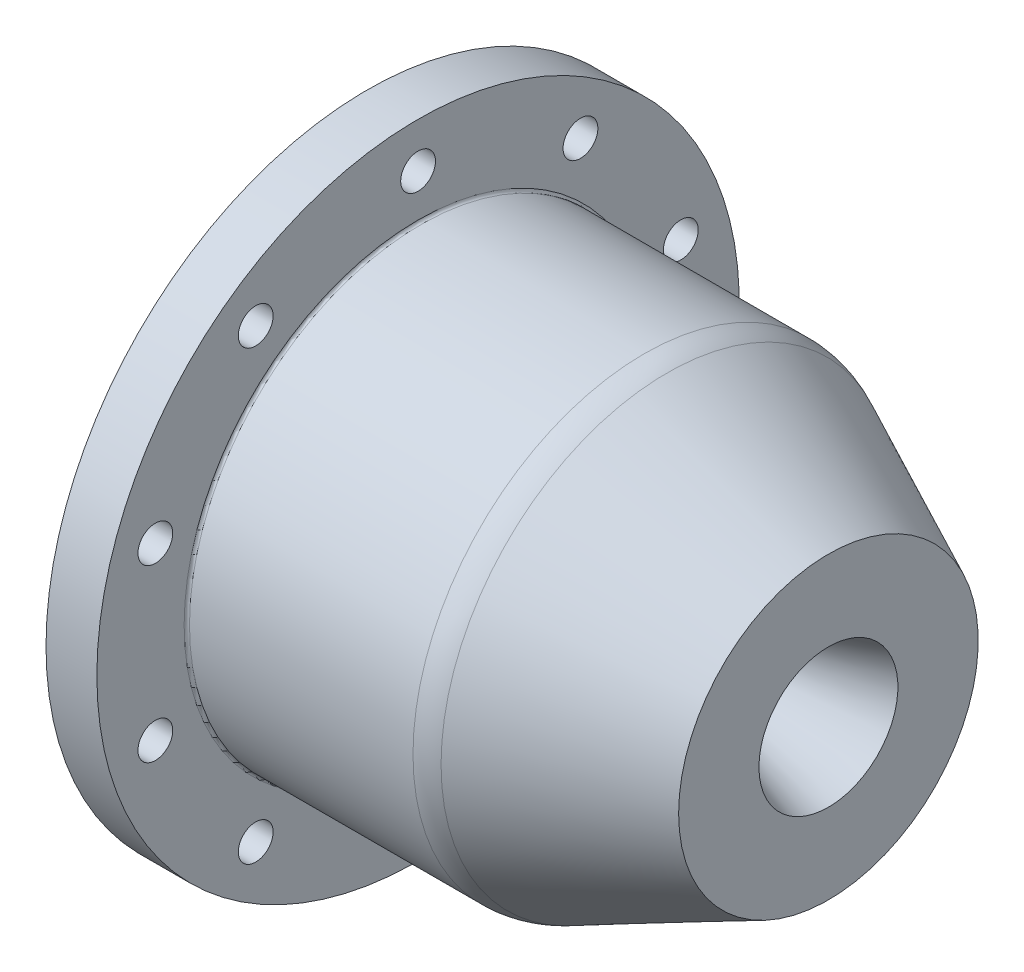
ISO-10303-21;
HEADER;
FILE_DESCRIPTION(('STEP AP214'),'2;1');
FILE_NAME('part.step','',(''),(''),'','','');
FILE_SCHEMA(('AUTOMOTIVE_DESIGN { 1 0 10303 214 1 1 1 1 }'));
ENDSEC;
DATA;
#1=APPLICATION_CONTEXT('core data for automotive mechanical design processes');
#2=APPLICATION_PROTOCOL_DEFINITION('international standard','automotive_design',2000,#1);
#3=PRODUCT_CONTEXT('',#1,'mechanical');
#4=PRODUCT('Part','Part','',(#3));
#5=PRODUCT_RELATED_PRODUCT_CATEGORY('part','',(#4));
#6=PRODUCT_DEFINITION_FORMATION('','',#4);
#7=PRODUCT_DEFINITION_CONTEXT('part definition',#1,'design');
#8=PRODUCT_DEFINITION('design','',#6,#7);
#9=PRODUCT_DEFINITION_SHAPE('','',#8);
#10=(LENGTH_UNIT() NAMED_UNIT(*) SI_UNIT(.MILLI.,.METRE.));
#11=(NAMED_UNIT(*) PLANE_ANGLE_UNIT() SI_UNIT($,.RADIAN.));
#12=(NAMED_UNIT(*) SI_UNIT($,.STERADIAN.) SOLID_ANGLE_UNIT());
#13=UNCERTAINTY_MEASURE_WITH_UNIT(LENGTH_MEASURE(1.E-05),#10,'distance_accuracy_value','');
#14=(GEOMETRIC_REPRESENTATION_CONTEXT(3) GLOBAL_UNCERTAINTY_ASSIGNED_CONTEXT((#13)) GLOBAL_UNIT_ASSIGNED_CONTEXT((#10,
#11,#12)) REPRESENTATION_CONTEXT('',''));
#15=CARTESIAN_POINT('',(0.,0.,0.));
#16=DIRECTION('',(0.,0.,1.));
#17=DIRECTION('',(1.,0.,0.));
#18=AXIS2_PLACEMENT_3D('',#15,#16,#17);
#19=CARTESIAN_POINT('',(21.0328892930556,0.,0.));
#20=DIRECTION('',(-1.,0.,0.));
#21=DIRECTION('',(0.,0.,1.));
#22=AXIS2_PLACEMENT_3D('',#19,#20,#21);
#23=TOROIDAL_SURFACE('',#22,15.834,9.);
#24=CARTESIAN_POINT('',(20.8212475059553,0.,0.));
#25=DIRECTION('',(1.,0.,0.));
#26=DIRECTION('',(0.,0.,-1.));
#27=AXIS2_PLACEMENT_3D('',#24,#25,#26);
#28=CIRCLE('',#27,6.83648880223242);
#29=CARTESIAN_POINT('',(20.8212475059553,0.,-6.83648880223242));
#30=VERTEX_POINT('',#29);
#31=EDGE_CURVE('E10',#30,#30,#28,.T.);
#32=ORIENTED_EDGE('',*,*,#31,.T.);
#33=EDGE_LOOP('',(#32));
#34=FACE_BOUND('',#33,.T.);
#35=CARTESIAN_POINT('',(13.2386606589956,0.,0.));
#36=DIRECTION('',(-1.,0.,0.));
#37=DIRECTION('',(0.,0.,1.));
#38=AXIS2_PLACEMENT_3D('',#35,#36,#37);
#39=CIRCLE('',#38,11.3340000000001);
#40=CARTESIAN_POINT('',(13.2386606589956,0.,11.3340000000001));
#41=VERTEX_POINT('',#40);
#42=EDGE_CURVE('E60',#41,#41,#39,.T.);
#43=ORIENTED_EDGE('',*,*,#42,.T.);
#44=EDGE_LOOP('',(#43));
#45=FACE_BOUND('',#44,.T.);
#46=ADVANCED_FACE('F34',(#34,#45),#23,.T.);
#47=CARTESIAN_POINT('',(7.79422863405996,0.,0.));
#48=DIRECTION('',(-1.,0.,0.));
#49=DIRECTION('',(0.,0.,1.));
#50=AXIS2_PLACEMENT_3D('',#47,#48,#49);
#51=CONICAL_SURFACE('',#50,20.5,1.03481414053965);
#52=ORIENTED_EDGE('',*,*,#42,.F.);
#53=EDGE_LOOP('',(#52));
#54=FACE_BOUND('',#53,.T.);
#55=CARTESIAN_POINT('',(7.79422863405996,0.,0.));
#56=DIRECTION('',(-1.,0.,0.));
#57=DIRECTION('',(0.,0.,1.));
#58=AXIS2_PLACEMENT_3D('',#55,#56,#57);
#59=CIRCLE('',#58,20.5);
#60=CARTESIAN_POINT('',(7.79422863405996,0.,20.5));
#61=VERTEX_POINT('',#60);
#62=EDGE_CURVE('E192',#61,#61,#59,.T.);
#63=ORIENTED_EDGE('',*,*,#62,.T.);
#64=EDGE_LOOP('',(#63));
#65=FACE_BOUND('',#64,.T.);
#66=ADVANCED_FACE('F103',(#54,#65),#51,.F.);
#67=CARTESIAN_POINT('',(0.,0.,0.));
#68=DIRECTION('',(-1.,0.,0.));
#69=DIRECTION('',(0.,0.,1.));
#70=AXIS2_PLACEMENT_3D('',#67,#68,#69);
#71=TOROIDAL_SURFACE('',#70,16.,9.);
#72=ORIENTED_EDGE('',*,*,#62,.F.);
#73=EDGE_LOOP('',(#72));
#74=FACE_BOUND('',#73,.T.);
#75=CARTESIAN_POINT('',(0.,0.,0.));
#76=DIRECTION('',(-1.,0.,0.));
#77=DIRECTION('',(0.,0.,1.));
#78=AXIS2_PLACEMENT_3D('',#75,#76,#77);
#79=CIRCLE('',#78,25.);
#80=CARTESIAN_POINT('',(0.,0.,25.));
#81=VERTEX_POINT('',#80);
#82=EDGE_CURVE('E189',#81,#81,#79,.T.);
#83=ORIENTED_EDGE('',*,*,#82,.T.);
#84=EDGE_LOOP('',(#83));
#85=FACE_BOUND('',#84,.T.);
#86=ADVANCED_FACE('F98',(#74,#85),#71,.F.);
#87=CARTESIAN_POINT('',(0.,0.,0.));
#88=DIRECTION('',(-1.,0.,0.));
#89=DIRECTION('',(0.,0.,1.));
#90=AXIS2_PLACEMENT_3D('',#87,#88,#89);
#91=CYLINDRICAL_SURFACE('',#90,25.);
#92=CARTESIAN_POINT('',(-23.35,13.2002627420486,-21.2309458936921));
#93=CARTESIAN_POINT('',(-23.45096609887,13.2002668339951,-21.2309439894007));
#94=CARTESIAN_POINT('',(-23.5520020704715,13.2075228830239,-21.2264372550872));
#95=CARTESIAN_POINT('',(-23.7512817731319,13.236333392609,-21.2084830976877));
#96=CARTESIAN_POINT('',(-23.8495221545168,13.2579043102433,-21.1950253840746));
#97=CARTESIAN_POINT('',(-24.0402953888173,13.3146305509543,-21.1594359046409));
#98=CARTESIAN_POINT('',(-24.1328313165295,13.3497784802236,-21.1373088598956));
#99=CARTESIAN_POINT('',(-24.3096103880352,13.4325120193215,-21.0848288832891));
#100=CARTESIAN_POINT('',(-24.3938553719108,13.4800948607522,-21.0544777823031));
#101=CARTESIAN_POINT('',(-24.5518487534148,13.5862794905071,-20.9861142621549));
#102=CARTESIAN_POINT('',(-24.625578790283,13.6449001484151,-20.9480887151034));
#103=CARTESIAN_POINT('',(-24.7602919172194,13.7712719697343,-20.8652286179706));
#104=CARTESIAN_POINT('',(-24.8212744651085,13.8390235213013,-20.820393778415));
#105=CARTESIAN_POINT('',(-24.9288202956351,13.9816466927085,-20.7248864448262));
#106=CARTESIAN_POINT('',(-24.9753680433373,14.0565258709516,-20.6742077414298));
#107=CARTESIAN_POINT('',(-25.052623547112,14.2110712615298,-20.5682819064808));
#108=CARTESIAN_POINT('',(-25.0833315179634,14.2907374089398,-20.5130348368847));
#109=CARTESIAN_POINT('',(-25.127983893808,14.4523423260966,-20.3994982965364));
#110=CARTESIAN_POINT('',(-25.1419575336896,14.5342768758962,-20.3412143177605));
#111=CARTESIAN_POINT('',(-25.1528349098418,14.6981683896604,-20.223106751331));
#112=CARTESIAN_POINT('',(-25.1497388911712,14.7801253532862,-20.1632831857927));
#113=CARTESIAN_POINT('',(-25.1265888584794,14.941587081606,-20.04392773414));
#114=CARTESIAN_POINT('',(-25.1065662867466,15.0210961098915,-19.9843955129195));
#115=CARTESIAN_POINT('',(-25.0501803496229,15.1756392371574,-19.8672942176502));
#116=CARTESIAN_POINT('',(-25.013816862575,15.2506733028173,-19.8097251582205));
#117=CARTESIAN_POINT('',(-24.9257459518355,15.3943378820168,-19.6982903513733));
#118=CARTESIAN_POINT('',(-24.8740243495265,15.4629624009649,-19.6444280829141));
#119=CARTESIAN_POINT('',(-24.7567156981266,15.591959081515,-19.5422003982673));
#120=CARTESIAN_POINT('',(-24.6911284402851,15.6523311188512,-19.4938350648542));
#121=CARTESIAN_POINT('',(-24.547772834418,15.7634319793512,-19.4041061279502));
#122=CARTESIAN_POINT('',(-24.4699771828953,15.8141386093502,-19.3627586617665));
#123=CARTESIAN_POINT('',(-24.3045085651699,15.9044836075416,-19.2886191231456));
#124=CARTESIAN_POINT('',(-24.2168355934982,15.9441219696056,-19.2558270554454));
#125=CARTESIAN_POINT('',(-24.0340828376075,16.0113645967966,-19.1999511619579));
#126=CARTESIAN_POINT('',(-23.9390024457073,16.0389678733755,-19.1768681336654));
#127=CARTESIAN_POINT('',(-23.7441423286693,16.0814637549854,-19.141246016476));
#128=CARTESIAN_POINT('',(-23.6443626770666,16.096356558843,-19.1287067626456));
#129=CARTESIAN_POINT('',(-23.4431760891635,16.1130517178512,-19.1146458421487));
#130=CARTESIAN_POINT('',(-23.3417733063581,16.1148833693601,-19.1130995182013));
#131=CARTESIAN_POINT('',(-23.1400082754598,16.1054895089573,-19.1210157664433));
#132=CARTESIAN_POINT('',(-23.0396460201576,16.0942640875744,-19.1304782623052));
#133=CARTESIAN_POINT('',(-22.8429196554795,16.0590465908007,-19.1600507551013));
#134=CARTESIAN_POINT('',(-22.7465514002561,16.0350681302239,-19.1801493970479));
#135=CARTESIAN_POINT('',(-22.5604204162005,15.974931827432,-19.2302645908768));
#136=CARTESIAN_POINT('',(-22.4706577667955,15.9387738387967,-19.2602812619919));
#137=CARTESIAN_POINT('',(-22.3001108588495,15.8550799501168,-19.3292362423628));
#138=CARTESIAN_POINT('',(-22.2193428420894,15.8075239411827,-19.3681903141253));
#139=CARTESIAN_POINT('',(-22.0692417467413,15.7022355499202,-19.4536470563593));
#140=CARTESIAN_POINT('',(-21.9999088156748,15.6445030363269,-19.5001498241993));
#141=CARTESIAN_POINT('',(-21.8745164122266,15.5201892714763,-19.5992357635154));
#142=CARTESIAN_POINT('',(-21.8184816978422,15.4535918701055,-19.6518300092136));
#143=CARTESIAN_POINT('',(-21.7214459516053,15.313344919332,-19.7613099392652));
#144=CARTESIAN_POINT('',(-21.6804448025965,15.2396954248918,-19.8181955901717));
#145=CARTESIAN_POINT('',(-21.6146828969911,15.0873709851147,-19.9344023499135));
#146=CARTESIAN_POINT('',(-21.5899066228709,15.0087009207479,-19.9937210738675));
#147=CARTESIAN_POINT('',(-21.5572470193628,14.8484242426891,-20.1130374211222));
#148=CARTESIAN_POINT('',(-21.5493634592616,14.7668176691182,-20.1730350351397));
#149=CARTESIAN_POINT('',(-21.5507154760921,14.6031540599151,-20.2918233074417));
#150=CARTESIAN_POINT('',(-21.5599123771475,14.5210984604309,-20.3506163884752));
#151=CARTESIAN_POINT('',(-21.5950838629638,14.3587172800508,-20.4655108505987));
#152=CARTESIAN_POINT('',(-21.6210584747545,14.2783917019424,-20.5216122273519));
#153=CARTESIAN_POINT('',(-21.6890388219524,14.1218373525927,-20.6296573721336));
#154=CARTESIAN_POINT('',(-21.7310441521619,14.0456084778574,-20.6816012452084));
#155=CARTESIAN_POINT('',(-21.8298887137846,13.8995320189649,-20.7800572191796));
#156=CARTESIAN_POINT('',(-21.8867276239761,13.8296842966678,-20.826569437667));
#157=CARTESIAN_POINT('',(-22.0137702813953,13.6983570422706,-20.9131830786092));
#158=CARTESIAN_POINT('',(-22.0840023700603,13.636895738623,-20.9532705684567));
#159=CARTESIAN_POINT('',(-22.2357922873625,13.5244205253195,-21.0260445619438));
#160=CARTESIAN_POINT('',(-22.3173528709844,13.4734091644834,-21.0587292601916));
#161=CARTESIAN_POINT('',(-22.4896048112851,13.3834063608373,-21.1160435296399));
#162=CARTESIAN_POINT('',(-22.5803097088112,13.344433101311,-21.140660918735));
#163=CARTESIAN_POINT('',(-22.7681128052767,13.2799097879075,-21.1812526222374));
#164=CARTESIAN_POINT('',(-22.8652034255637,13.2543441340559,-21.197236981969));
#165=CARTESIAN_POINT('',(-23.0273994398461,13.224057887595,-21.2161371156145));
#166=CARTESIAN_POINT('',(-23.0914585093618,13.2151478027276,-21.2216850982529));
#167=CARTESIAN_POINT('',(-23.2203354460411,13.2032489215665,-21.2290900952888));
#168=CARTESIAN_POINT('',(-23.2851533117532,13.200260113947,-21.2309471167462));
#169=CARTESIAN_POINT('',(-23.35,13.2002627420486,-21.2309458936921));
#170=B_SPLINE_CURVE_WITH_KNOTS('',3,(#92,#93,#94,#95,#96,#97,#98,#99,#100,#101,#102,#103,#104,
#105,#106,#107,#108,#109,#110,#111,#112,#113,#114,#115,#116,#117,#118,#119,#120,#121,#122,#123,
#124,#125,#126,#127,#128,#129,#130,#131,#132,#133,#134,#135,#136,#137,#138,#139,#140,#141,#142,
#143,#144,#145,#146,#147,#148,#149,#150,#151,#152,#153,#154,#155,#156,#157,#158,#159,#160,#161,
#162,#163,#164,#165,#166,#167,#168,#169),.UNSPECIFIED.,.T.,.F.,(4,2,2,2,2,2,2,2,2,2,2,2,2,2,2,2,
2,2,2,2,2,2,2,2,2,2,2,2,2,2,2,2,2,2,2,2,2,2,4),(0.,0.302661550799539,0.605671660418703,
0.908516988048946,1.21129495025204,1.5145953017647,1.81790855069315,2.12154710574395,
2.42518154350829,2.72828475424094,3.03138361351642,3.33392067891971,3.63645999672876,
3.93927949194872,4.24210354651225,4.54561476671345,4.84912615496436,5.15266246859357,
5.45619403399503,5.75904455882426,6.06189298391082,6.36441874294395,6.66694813901892,
6.97001525133769,7.27308627315242,7.57671718802164,7.88034573664839,8.18368346817249,
8.48701705681466,8.78966463403932,9.09231269884603,9.39495311432607,9.69758697665981,
10.0008684981884,10.3042239045252,10.6080353066616,10.9114924304522,11.1058808141678,
11.3002688260711),.UNSPECIFIED.);
#171=CARTESIAN_POINT('',(-23.35,13.2002627420486,-21.2309458936921));
#172=VERTEX_POINT('',#171);
#173=EDGE_CURVE('E68',#172,#172,#170,.T.);
#174=ORIENTED_EDGE('',*,*,#173,.T.);
#175=EDGE_LOOP('',(#174));
#176=FACE_BOUND('',#175,.T.);
#177=ORIENTED_EDGE('',*,*,#82,.F.);
#178=EDGE_LOOP('',(#177));
#179=FACE_BOUND('',#178,.T.);
#180=CARTESIAN_POINT('',(-46.7,0.,0.));
#181=DIRECTION('',(-1.,0.,0.));
#182=DIRECTION('',(0.,0.,1.));
#183=AXIS2_PLACEMENT_3D('',#180,#181,#182);
#184=CIRCLE('',#183,25.);
#185=CARTESIAN_POINT('',(-46.7,0.,25.));
#186=VERTEX_POINT('',#185);
#187=EDGE_CURVE('E186',#186,#186,#184,.T.);
#188=ORIENTED_EDGE('',*,*,#187,.T.);
#189=EDGE_LOOP('',(#188));
#190=FACE_BOUND('',#189,.T.);
#191=ADVANCED_FACE('F92',(#176,#179,#190),#91,.F.);
#192=CARTESIAN_POINT('',(-46.7,31.,0.));
#193=DIRECTION('',(1.,0.,0.));
#194=DIRECTION('',(0.,0.,-1.));
#195=AXIS2_PLACEMENT_3D('',#192,#193,#194);
#196=PLANE('',#195);
#197=ORIENTED_EDGE('',*,*,#187,.F.);
#198=EDGE_LOOP('',(#197));
#199=FACE_BOUND('',#198,.T.);
#200=CARTESIAN_POINT('',(-46.7,0.,0.));
#201=DIRECTION('',(-1.,0.,0.));
#202=DIRECTION('',(0.,0.,1.));
#203=AXIS2_PLACEMENT_3D('',#200,#201,#202);
#204=CIRCLE('',#203,31.);
#205=CARTESIAN_POINT('',(-46.7,0.,31.));
#206=VERTEX_POINT('',#205);
#207=EDGE_CURVE('E183',#206,#206,#204,.T.);
#208=ORIENTED_EDGE('',*,*,#207,.T.);
#209=EDGE_LOOP('',(#208));
#210=FACE_BOUND('',#209,.T.);
#211=ADVANCED_FACE('F97',(#199,#210),#196,.F.);
#212=CARTESIAN_POINT('',(0.,0.,0.));
#213=DIRECTION('',(-1.,0.,0.));
#214=DIRECTION('',(0.,0.,1.));
#215=AXIS2_PLACEMENT_3D('',#212,#213,#214);
#216=CYLINDRICAL_SURFACE('',#215,31.);
#217=ORIENTED_EDGE('',*,*,#207,.F.);
#218=EDGE_LOOP('',(#217));
#219=FACE_BOUND('',#218,.T.);
#220=CARTESIAN_POINT('',(-46.2,0.,0.));
#221=DIRECTION('',(-1.,0.,0.));
#222=DIRECTION('',(0.,0.,1.));
#223=AXIS2_PLACEMENT_3D('',#220,#221,#222);
#224=CIRCLE('',#223,31.);
#225=CARTESIAN_POINT('',(-46.2,0.,31.));
#226=VERTEX_POINT('',#225);
#227=EDGE_CURVE('E174',#226,#226,#224,.T.);
#228=ORIENTED_EDGE('',*,*,#227,.T.);
#229=EDGE_LOOP('',(#228));
#230=FACE_BOUND('',#229,.T.);
#231=ADVANCED_FACE('F275',(#219,#230),#216,.T.);
#232=CARTESIAN_POINT('',(-46.2,60.,0.));
#233=DIRECTION('',(1.,0.,0.));
#234=DIRECTION('',(0.,0.,-1.));
#235=AXIS2_PLACEMENT_3D('',#232,#233,#234);
#236=PLANE('',#235);
#237=CARTESIAN_POINT('',(-46.2,41.7452769097422,-30.3297190182905));
#238=DIRECTION('',(-1.,0.,0.));
#239=DIRECTION('',(0.,0.,1.));
#240=AXIS2_PLACEMENT_3D('',#237,#238,#239);
#241=CIRCLE('',#240,3.25000000000354);
#242=CARTESIAN_POINT('',(-46.2,41.7452769097422,-27.079719018287));
#243=VERTEX_POINT('',#242);
#244=EDGE_CURVE('E90',#243,#243,#241,.T.);
#245=ORIENTED_EDGE('',*,*,#244,.F.);
#246=EDGE_LOOP('',(#245));
#247=FACE_BOUND('',#246,.T.);
#248=CARTESIAN_POINT('',(-46.2,15.945276909739,-49.0745162408245));
#249=DIRECTION('',(-1.,0.,0.));
#250=DIRECTION('',(0.,0.,1.));
#251=AXIS2_PLACEMENT_3D('',#248,#249,#250);
#252=CIRCLE('',#251,3.25000000000819);
#253=CARTESIAN_POINT('',(-46.2,15.945276909739,-45.8245162408163));
#254=VERTEX_POINT('',#253);
#255=EDGE_CURVE('E212',#254,#254,#252,.T.);
#256=ORIENTED_EDGE('',*,*,#255,.F.);
#257=EDGE_LOOP('',(#256));
#258=FACE_BOUND('',#257,.T.);
#259=CARTESIAN_POINT('',(-46.2,-15.9452769097556,-49.0745162408191));
#260=DIRECTION('',(-1.,0.,0.));
#261=DIRECTION('',(0.,0.,1.));
#262=AXIS2_PLACEMENT_3D('',#259,#260,#261);
#263=CIRCLE('',#262,3.25000000000664);
#264=CARTESIAN_POINT('',(-46.2,-15.9452769097556,-45.8245162408125));
#265=VERTEX_POINT('',#264);
#266=EDGE_CURVE('E211',#265,#265,#263,.T.);
#267=ORIENTED_EDGE('',*,*,#266,.F.);
#268=EDGE_LOOP('',(#267));
#269=FACE_BOUND('',#268,.T.);
#270=CARTESIAN_POINT('',(-46.2,-41.7452769097524,-30.3297190182765));
#271=DIRECTION('',(-1.,0.,0.));
#272=DIRECTION('',(0.,0.,1.));
#273=AXIS2_PLACEMENT_3D('',#270,#271,#272);
#274=CIRCLE('',#273,3.25000000000382);
#275=CARTESIAN_POINT('',(-46.2,-41.7452769097524,-27.0797190182726));
#276=VERTEX_POINT('',#275);
#277=EDGE_CURVE('E210',#276,#276,#274,.T.);
#278=ORIENTED_EDGE('',*,*,#277,.F.);
#279=EDGE_LOOP('',(#278));
#280=FACE_BOUND('',#279,.T.);
#281=CARTESIAN_POINT('',(-46.2,-51.6,1.68198657821432E-11));
#282=DIRECTION('',(-1.,0.,0.));
#283=DIRECTION('',(0.,0.,1.));
#284=AXIS2_PLACEMENT_3D('',#281,#282,#283);
#285=CIRCLE('',#284,3.25000000000069);
#286=CARTESIAN_POINT('',(-46.2,-51.6,3.25000000001751));
#287=VERTEX_POINT('',#286);
#288=EDGE_CURVE('E208',#287,#287,#285,.T.);
#289=ORIENTED_EDGE('',*,*,#288,.F.);
#290=EDGE_LOOP('',(#289));
#291=FACE_BOUND('',#290,.T.);
#292=CARTESIAN_POINT('',(-46.2,-41.7452769097422,30.3297190183068));
#293=DIRECTION('',(-1.,0.,0.));
#294=DIRECTION('',(0.,0.,1.));
#295=AXIS2_PLACEMENT_3D('',#292,#293,#294);
#296=CIRCLE('',#295,3.24999999999777);
#297=CARTESIAN_POINT('',(-46.2,-41.7452769097422,33.5797190183045));
#298=VERTEX_POINT('',#297);
#299=EDGE_CURVE('E206',#298,#298,#296,.T.);
#300=ORIENTED_EDGE('',*,*,#299,.F.);
#301=EDGE_LOOP('',(#300));
#302=FACE_BOUND('',#301,.T.);
#303=CARTESIAN_POINT('',(-46.2,-15.945276909739,49.0745162408407));
#304=DIRECTION('',(-1.,0.,0.));
#305=DIRECTION('',(0.,0.,1.));
#306=AXIS2_PLACEMENT_3D('',#303,#304,#305);
#307=CIRCLE('',#306,3.24999999999712);
#308=CARTESIAN_POINT('',(-46.2,-15.945276909739,52.3245162408379));
#309=VERTEX_POINT('',#308);
#310=EDGE_CURVE('E204',#309,#309,#307,.T.);
#311=ORIENTED_EDGE('',*,*,#310,.F.);
#312=EDGE_LOOP('',(#311));
#313=FACE_BOUND('',#312,.T.);
#314=CARTESIAN_POINT('',(-46.2,15.9452769097556,49.0745162408354));
#315=DIRECTION('',(-1.,0.,0.));
#316=DIRECTION('',(0.,0.,1.));
#317=AXIS2_PLACEMENT_3D('',#314,#315,#316);
#318=CIRCLE('',#317,3.24999999999816);
#319=CARTESIAN_POINT('',(-46.2,15.9452769097556,52.3245162408335));
#320=VERTEX_POINT('',#319);
#321=EDGE_CURVE('E202',#320,#320,#318,.T.);
#322=ORIENTED_EDGE('',*,*,#321,.F.);
#323=EDGE_LOOP('',(#322));
#324=FACE_BOUND('',#323,.T.);
#325=CARTESIAN_POINT('',(-46.2,41.7452769097516,30.3297190182928));
#326=DIRECTION('',(-1.,0.,0.));
#327=DIRECTION('',(0.,0.,1.));
#328=AXIS2_PLACEMENT_3D('',#325,#326,#327);
#329=CIRCLE('',#328,3.25000000000001);
#330=CARTESIAN_POINT('',(-46.2,41.7452769097516,33.5797190182928));
#331=VERTEX_POINT('',#330);
#332=EDGE_CURVE('E200',#331,#331,#329,.T.);
#333=ORIENTED_EDGE('',*,*,#332,.F.);
#334=EDGE_LOOP('',(#333));
#335=FACE_BOUND('',#334,.T.);
#336=CARTESIAN_POINT('',(-46.2,51.6,-5.82898316369605E-13));
#337=DIRECTION('',(-1.,0.,0.));
#338=DIRECTION('',(0.,0.,1.));
#339=AXIS2_PLACEMENT_3D('',#336,#337,#338);
#340=CIRCLE('',#339,3.25);
#341=CARTESIAN_POINT('',(-46.2,51.6,3.24999999999942));
#342=VERTEX_POINT('',#341);
#343=EDGE_CURVE('E198',#342,#342,#340,.T.);
#344=ORIENTED_EDGE('',*,*,#343,.F.);
#345=EDGE_LOOP('',(#344));
#346=FACE_BOUND('',#345,.T.);
#347=ORIENTED_EDGE('',*,*,#227,.F.);
#348=EDGE_LOOP('',(#347));
#349=FACE_BOUND('',#348,.T.);
#350=CARTESIAN_POINT('',(-46.2,0.,0.));
#351=DIRECTION('',(-1.,0.,0.));
#352=DIRECTION('',(0.,0.,1.));
#353=AXIS2_PLACEMENT_3D('',#350,#351,#352);
#354=CIRCLE('',#353,60.);
#355=CARTESIAN_POINT('',(-46.2,0.,60.));
#356=VERTEX_POINT('',#355);
#357=EDGE_CURVE('E170',#356,#356,#354,.T.);
#358=ORIENTED_EDGE('',*,*,#357,.T.);
#359=EDGE_LOOP('',(#358));
#360=FACE_BOUND('',#359,.T.);
#361=ADVANCED_FACE('F280',(#247,#258,#269,#280,#291,#302,#313,#324,#335,#346,#349,#360),#236,.F.);
#362=CARTESIAN_POINT('',(0.,0.,0.));
#363=DIRECTION('',(-1.,0.,0.));
#364=DIRECTION('',(0.,0.,1.));
#365=AXIS2_PLACEMENT_3D('',#362,#363,#364);
#366=CYLINDRICAL_SURFACE('',#365,60.);
#367=ORIENTED_EDGE('',*,*,#357,.F.);
#368=EDGE_LOOP('',(#367));
#369=FACE_BOUND('',#368,.T.);
#370=CARTESIAN_POINT('',(-36.7,0.,0.));
#371=DIRECTION('',(-1.,0.,0.));
#372=DIRECTION('',(0.,0.,1.));
#373=AXIS2_PLACEMENT_3D('',#370,#371,#372);
#374=CIRCLE('',#373,60.);
#375=CARTESIAN_POINT('',(-36.7,0.,60.));
#376=VERTEX_POINT('',#375);
#377=EDGE_CURVE('E168',#376,#376,#374,.T.);
#378=ORIENTED_EDGE('',*,*,#377,.T.);
#379=EDGE_LOOP('',(#378));
#380=FACE_BOUND('',#379,.T.);
#381=ADVANCED_FACE('F126',(#369,#380),#366,.T.);
#382=CARTESIAN_POINT('',(-36.7,60.,0.));
#383=DIRECTION('',(-1.,0.,0.));
#384=DIRECTION('',(0.,0.,1.));
#385=AXIS2_PLACEMENT_3D('',#382,#383,#384);
#386=PLANE('',#385);
#387=CARTESIAN_POINT('',(-36.7,0.,0.));
#388=DIRECTION('',(-1.,0.,0.));
#389=DIRECTION('',(0.,0.,1.));
#390=AXIS2_PLACEMENT_3D('',#387,#388,#389);
#391=CIRCLE('',#390,43.7);
#392=CARTESIAN_POINT('',(-36.7,0.,43.7));
#393=VERTEX_POINT('',#392);
#394=EDGE_CURVE('E49',#393,#393,#391,.T.);
#395=ORIENTED_EDGE('',*,*,#394,.T.);
#396=EDGE_LOOP('',(#395));
#397=FACE_BOUND('',#396,.T.);
#398=CARTESIAN_POINT('',(-36.7,41.7452769097422,-30.3297190182905));
#399=DIRECTION('',(-1.,0.,0.));
#400=DIRECTION('',(0.,0.,1.));
#401=AXIS2_PLACEMENT_3D('',#398,#399,#400);
#402=CIRCLE('',#401,3.25000000000354);
#403=CARTESIAN_POINT('',(-36.7,41.7452769097422,-27.079719018287));
#404=VERTEX_POINT('',#403);
#405=EDGE_CURVE('E69',#404,#404,#402,.T.);
#406=ORIENTED_EDGE('',*,*,#405,.T.);
#407=EDGE_LOOP('',(#406));
#408=FACE_BOUND('',#407,.T.);
#409=CARTESIAN_POINT('',(-36.7,15.945276909739,-49.0745162408245));
#410=DIRECTION('',(-1.,0.,0.));
#411=DIRECTION('',(0.,0.,1.));
#412=AXIS2_PLACEMENT_3D('',#409,#410,#411);
#413=CIRCLE('',#412,3.25000000000819);
#414=CARTESIAN_POINT('',(-36.7,15.945276909739,-45.8245162408163));
#415=VERTEX_POINT('',#414);
#416=EDGE_CURVE('E133',#415,#415,#413,.T.);
#417=ORIENTED_EDGE('',*,*,#416,.T.);
#418=EDGE_LOOP('',(#417));
#419=FACE_BOUND('',#418,.T.);
#420=CARTESIAN_POINT('',(-36.7,-15.9452769097556,-49.0745162408191));
#421=DIRECTION('',(-1.,0.,0.));
#422=DIRECTION('',(0.,0.,1.));
#423=AXIS2_PLACEMENT_3D('',#420,#421,#422);
#424=CIRCLE('',#423,3.25000000000664);
#425=CARTESIAN_POINT('',(-36.7,-15.9452769097556,-45.8245162408125));
#426=VERTEX_POINT('',#425);
#427=EDGE_CURVE('E137',#426,#426,#424,.T.);
#428=ORIENTED_EDGE('',*,*,#427,.T.);
#429=EDGE_LOOP('',(#428));
#430=FACE_BOUND('',#429,.T.);
#431=CARTESIAN_POINT('',(-36.7,-41.7452769097524,-30.3297190182765));
#432=DIRECTION('',(-1.,0.,0.));
#433=DIRECTION('',(0.,0.,1.));
#434=AXIS2_PLACEMENT_3D('',#431,#432,#433);
#435=CIRCLE('',#434,3.25000000000382);
#436=CARTESIAN_POINT('',(-36.7,-41.7452769097524,-27.0797190182726));
#437=VERTEX_POINT('',#436);
#438=EDGE_CURVE('E141',#437,#437,#435,.T.);
#439=ORIENTED_EDGE('',*,*,#438,.T.);
#440=EDGE_LOOP('',(#439));
#441=FACE_BOUND('',#440,.T.);
#442=CARTESIAN_POINT('',(-36.7,-51.6,1.68198657821432E-11));
#443=DIRECTION('',(-1.,0.,0.));
#444=DIRECTION('',(0.,0.,1.));
#445=AXIS2_PLACEMENT_3D('',#442,#443,#444);
#446=CIRCLE('',#445,3.25000000000069);
#447=CARTESIAN_POINT('',(-36.7,-51.6,3.25000000001751));
#448=VERTEX_POINT('',#447);
#449=EDGE_CURVE('E145',#448,#448,#446,.T.);
#450=ORIENTED_EDGE('',*,*,#449,.T.);
#451=EDGE_LOOP('',(#450));
#452=FACE_BOUND('',#451,.T.);
#453=CARTESIAN_POINT('',(-36.7,-41.7452769097422,30.3297190183068));
#454=DIRECTION('',(-1.,0.,0.));
#455=DIRECTION('',(0.,0.,1.));
#456=AXIS2_PLACEMENT_3D('',#453,#454,#455);
#457=CIRCLE('',#456,3.24999999999777);
#458=CARTESIAN_POINT('',(-36.7,-41.7452769097422,33.5797190183045));
#459=VERTEX_POINT('',#458);
#460=EDGE_CURVE('E149',#459,#459,#457,.T.);
#461=ORIENTED_EDGE('',*,*,#460,.T.);
#462=EDGE_LOOP('',(#461));
#463=FACE_BOUND('',#462,.T.);
#464=CARTESIAN_POINT('',(-36.7,-15.945276909739,49.0745162408407));
#465=DIRECTION('',(-1.,0.,0.));
#466=DIRECTION('',(0.,0.,1.));
#467=AXIS2_PLACEMENT_3D('',#464,#465,#466);
#468=CIRCLE('',#467,3.24999999999712);
#469=CARTESIAN_POINT('',(-36.7,-15.945276909739,52.3245162408379));
#470=VERTEX_POINT('',#469);
#471=EDGE_CURVE('E153',#470,#470,#468,.T.);
#472=ORIENTED_EDGE('',*,*,#471,.T.);
#473=EDGE_LOOP('',(#472));
#474=FACE_BOUND('',#473,.T.);
#475=CARTESIAN_POINT('',(-36.7,15.9452769097556,49.0745162408354));
#476=DIRECTION('',(-1.,0.,0.));
#477=DIRECTION('',(0.,0.,1.));
#478=AXIS2_PLACEMENT_3D('',#475,#476,#477);
#479=CIRCLE('',#478,3.24999999999816);
#480=CARTESIAN_POINT('',(-36.7,15.9452769097556,52.3245162408335));
#481=VERTEX_POINT('',#480);
#482=EDGE_CURVE('E157',#481,#481,#479,.T.);
#483=ORIENTED_EDGE('',*,*,#482,.T.);
#484=EDGE_LOOP('',(#483));
#485=FACE_BOUND('',#484,.T.);
#486=CARTESIAN_POINT('',(-36.7,41.7452769097516,30.3297190182928));
#487=DIRECTION('',(-1.,0.,0.));
#488=DIRECTION('',(0.,0.,1.));
#489=AXIS2_PLACEMENT_3D('',#486,#487,#488);
#490=CIRCLE('',#489,3.25000000000001);
#491=CARTESIAN_POINT('',(-36.7,41.7452769097516,33.5797190182928));
#492=VERTEX_POINT('',#491);
#493=EDGE_CURVE('E161',#492,#492,#490,.T.);
#494=ORIENTED_EDGE('',*,*,#493,.T.);
#495=EDGE_LOOP('',(#494));
#496=FACE_BOUND('',#495,.T.);
#497=CARTESIAN_POINT('',(-36.7,51.6,-5.82898316369605E-13));
#498=DIRECTION('',(-1.,0.,0.));
#499=DIRECTION('',(0.,0.,1.));
#500=AXIS2_PLACEMENT_3D('',#497,#498,#499);
#501=CIRCLE('',#500,3.25);
#502=CARTESIAN_POINT('',(-36.7,51.6,3.24999999999942));
#503=VERTEX_POINT('',#502);
#504=EDGE_CURVE('E165',#503,#503,#501,.T.);
#505=ORIENTED_EDGE('',*,*,#504,.T.);
#506=EDGE_LOOP('',(#505));
#507=FACE_BOUND('',#506,.T.);
#508=ORIENTED_EDGE('',*,*,#377,.F.);
#509=EDGE_LOOP('',(#508));
#510=FACE_BOUND('',#509,.T.);
#511=ADVANCED_FACE('F123',(#397,#408,#419,#430,#441,#452,#463,#474,#485,#496,#507,#510),#386,.F.);
#512=CARTESIAN_POINT('',(0.,0.,0.));
#513=DIRECTION('',(-1.,0.,0.));
#514=DIRECTION('',(0.,0.,1.));
#515=AXIS2_PLACEMENT_3D('',#512,#513,#514);
#516=CYLINDRICAL_SURFACE('',#515,43.2);
#517=CARTESIAN_POINT('',(-36.2,0.,0.));
#518=DIRECTION('',(-1.,0.,0.));
#519=DIRECTION('',(0.,0.,1.));
#520=AXIS2_PLACEMENT_3D('',#517,#518,#519);
#521=CIRCLE('',#520,43.2);
#522=CARTESIAN_POINT('',(-36.2,0.,43.2));
#523=VERTEX_POINT('',#522);
#524=EDGE_CURVE('E45',#523,#523,#521,.F.);
#525=ORIENTED_EDGE('',*,*,#524,.T.);
#526=EDGE_LOOP('',(#525));
#527=FACE_BOUND('',#526,.T.);
#528=CARTESIAN_POINT('',(5.54858345659781,0.,0.));
#529=DIRECTION('',(1.,0.,0.));
#530=DIRECTION('',(0.,0.,-1.));
#531=AXIS2_PLACEMENT_3D('',#528,#529,#530);
#532=CIRCLE('',#531,43.2);
#533=CARTESIAN_POINT('',(5.54858345659781,0.,-43.2));
#534=VERTEX_POINT('',#533);
#535=EDGE_CURVE('E57',#534,#534,#532,.F.);
#536=ORIENTED_EDGE('',*,*,#535,.T.);
#537=EDGE_LOOP('',(#536));
#538=FACE_BOUND('',#537,.T.);
#539=CARTESIAN_POINT('',(-23.35,23.9140407870683,-35.9771962947981));
#540=CARTESIAN_POINT('',(-23.2489403049165,23.9140446977867,-35.9771940777686));
#541=CARTESIAN_POINT('',(-23.1478084490488,23.9211602202927,-35.9724671535847));
#542=CARTESIAN_POINT('',(-22.9483331923407,23.9494278649997,-35.9536532508918));
#543=CARTESIAN_POINT('',(-22.8499932430581,23.9705966347771,-35.9395551712203));
#544=CARTESIAN_POINT('',(-22.659020355314,24.0263129683411,-35.9023314170109));
#545=CARTESIAN_POINT('',(-22.5663845903896,24.0608538433101,-35.8792102558332));
#546=CARTESIAN_POINT('',(-22.3894255810698,24.1422448468337,-35.8244945067186));
#547=CARTESIAN_POINT('',(-22.3051003492047,24.1890920224568,-35.7929019514789));
#548=CARTESIAN_POINT('',(-22.147067609653,24.2937074305197,-35.7219787181319));
#549=CARTESIAN_POINT('',(-22.0733670078781,24.3514827102292,-35.682643046006));
#550=CARTESIAN_POINT('',(-21.9387342623285,24.4761944272226,-35.5972134729974));
#551=CARTESIAN_POINT('',(-21.8778026336426,24.5431312338943,-35.5511192996102));
#552=CARTESIAN_POINT('',(-21.770420889019,24.6841912760135,-35.4533222410332));
#553=CARTESIAN_POINT('',(-21.7239757830104,24.7583169860345,-35.4016174238071));
#554=CARTESIAN_POINT('',(-21.6469177535709,24.9115459422904,-35.2939603493714));
#555=CARTESIAN_POINT('',(-21.6163047372452,24.9906491593167,-35.2380081170857));
#556=CARTESIAN_POINT('',(-21.5717971072117,25.1514776947215,-35.1233954687089));
#557=CARTESIAN_POINT('',(-21.5578927048158,25.2332014490243,-35.0647366591958));
#558=CARTESIAN_POINT('',(-21.5471668055457,25.3969638206388,-34.9463079321161));
#559=CARTESIAN_POINT('',(-21.5503452058651,25.4790024360529,-34.8865380212383));
#560=CARTESIAN_POINT('',(-21.5736865220821,25.6410189509379,-34.7676320864713));
#561=CARTESIAN_POINT('',(-21.5938388933874,25.7209980980127,-34.7084956921203));
#562=CARTESIAN_POINT('',(-21.6505397663374,25.8767212155254,-34.5925530852438));
#563=CARTESIAN_POINT('',(-21.6870883211909,25.9524651722184,-34.5357468802808));
#564=CARTESIAN_POINT('',(-21.7755561440563,26.0976660053033,-34.4261545175905));
#565=CARTESIAN_POINT('',(-21.8274802300641,26.1671209020669,-34.3733696264892));
#566=CARTESIAN_POINT('',(-21.9452216436151,26.2978443636113,-34.27346147063));
#567=CARTESIAN_POINT('',(-22.0110390376015,26.3591128892394,-34.2263382329499));
#568=CARTESIAN_POINT('',(-22.1547583969566,26.4718775929132,-34.1391972706679));
#569=CARTESIAN_POINT('',(-22.2326695098486,26.5233663075446,-34.0991849742321));
#570=CARTESIAN_POINT('',(-22.3983325049526,26.6151577006412,-34.0275885163842));
#571=CARTESIAN_POINT('',(-22.4860843892405,26.6554603767469,-33.99600435675));
#572=CARTESIAN_POINT('',(-22.668943368505,26.7238273817635,-33.9422885154922));
#573=CARTESIAN_POINT('',(-22.7640506177418,26.7518914539188,-33.9201570321783));
#574=CARTESIAN_POINT('',(-22.9589181470716,26.7950498254279,-33.8860748321644));
#575=CARTESIAN_POINT('',(-23.0586784028372,26.8101441925835,-33.8741240622429));
#576=CARTESIAN_POINT('',(-23.2599397751825,26.8269653118966,-33.8608040325046));
#577=CARTESIAN_POINT('',(-23.3614395263179,26.828702107274,-33.8594268226972));
#578=CARTESIAN_POINT('',(-23.5633692808023,26.8187896012272,-33.867278644219));
#579=CARTESIAN_POINT('',(-23.6637992865899,26.807140330325,-33.8765076513648));
#580=CARTESIAN_POINT('',(-23.860702878974,26.7707639784972,-33.905261061754));
#581=CARTESIAN_POINT('',(-23.9571778415336,26.7460414880825,-33.9247818511492));
#582=CARTESIAN_POINT('',(-24.143475103505,26.6841626336197,-33.973475030205));
#583=CARTESIAN_POINT('',(-24.2332973763703,26.6470062199595,-34.0026474583762));
#584=CARTESIAN_POINT('',(-24.4037984514171,26.5612010890639,-34.0697160597769));
#585=CARTESIAN_POINT('',(-24.484471754552,26.5125455137945,-34.1076174385567));
#586=CARTESIAN_POINT('',(-24.634329594481,26.4050307321584,-34.1909193266035));
#587=CARTESIAN_POINT('',(-24.7035140789292,26.3461714793036,-34.2363198700367));
#588=CARTESIAN_POINT('',(-24.8284732605617,26.2197708901971,-34.3332193058529));
#589=CARTESIAN_POINT('',(-24.8842396984101,26.152224245563,-34.3847219253469));
#590=CARTESIAN_POINT('',(-24.9807233315642,26.0102946866059,-34.4922090360039));
#591=CARTESIAN_POINT('',(-25.0214405773499,25.935911795215,-34.5481935121325));
#592=CARTESIAN_POINT('',(-25.0866555393826,25.7823680431635,-34.6629293697073));
#593=CARTESIAN_POINT('',(-25.1111585708079,25.7032087575459,-34.7216798376629));
#594=CARTESIAN_POINT('',(-25.1432669681333,25.5422894446261,-34.8402272236852));
#595=CARTESIAN_POINT('',(-25.1508723909008,25.4605294260775,-34.9000241382296));
#596=CARTESIAN_POINT('',(-25.1489690786854,25.2967801687752,-35.0188969253678));
#597=CARTESIAN_POINT('',(-25.1394733200974,25.2147911509168,-35.0779733104578));
#598=CARTESIAN_POINT('',(-25.1036639666782,25.0528694093974,-35.1938012636448));
#599=CARTESIAN_POINT('',(-25.0773503392931,24.9729366897169,-35.2505528272416));
#600=CARTESIAN_POINT('',(-25.008654600171,24.8174467648679,-35.3601950476082));
#601=CARTESIAN_POINT('',(-24.9662722834613,24.7418896155284,-35.4130856551173));
#602=CARTESIAN_POINT('',(-24.8666450508591,24.5973741208746,-35.5136163262553));
#603=CARTESIAN_POINT('',(-24.8094006298997,24.5284155559209,-35.5612565646551));
#604=CARTESIAN_POINT('',(-24.6816297048731,24.3991008915211,-35.6501058314084));
#605=CARTESIAN_POINT('',(-24.6110945778544,24.3387504218836,-35.6913106525712));
#606=CARTESIAN_POINT('',(-24.4587422063884,24.2285065228161,-35.7662400532508));
#607=CARTESIAN_POINT('',(-24.3769221820378,24.1786156776481,-35.7999627842854));
#608=CARTESIAN_POINT('',(-24.2042737604871,24.0907921251226,-35.8591208715008));
#609=CARTESIAN_POINT('',(-24.11343812021,24.0528691365593,-35.8845494928038));
#610=CARTESIAN_POINT('',(-23.9254575282956,23.9902358235778,-35.9264529082284));
#611=CARTESIAN_POINT('',(-23.8283202174876,23.9655098215144,-35.9429383270047));
#612=CARTESIAN_POINT('',(-23.6671454325341,23.9365511002851,-35.9622258638041));
#613=CARTESIAN_POINT('',(-23.6041529974096,23.9281212033896,-35.9678337146017));
#614=CARTESIAN_POINT('',(-23.4774499429692,23.9168648151495,-35.9753196281632));
#615=CARTESIAN_POINT('',(-23.4137393240716,23.9140383205406,-35.9771976930999));
#616=CARTESIAN_POINT('',(-23.35,23.9140407870683,-35.9771962947981));
#617=B_SPLINE_CURVE_WITH_KNOTS('',3,(#539,#540,#541,#542,#543,#544,#545,#546,#547,#548,#549,
#550,#551,#552,#553,#554,#555,#556,#557,#558,#559,#560,#561,#562,#563,#564,#565,#566,#567,#568,
#569,#570,#571,#572,#573,#574,#575,#576,#577,#578,#579,#580,#581,#582,#583,#584,#585,#586,#587,
#588,#589,#590,#591,#592,#593,#594,#595,#596,#597,#598,#599,#600,#601,#602,#603,#604,#605,#606,
#607,#608,#609,#610,#611,#612,#613,#614,#615,#616),.UNSPECIFIED.,.T.,.F.,(4,2,2,2,2,2,2,2,2,2,2,
2,2,2,2,2,2,2,2,2,2,2,2,2,2,2,2,2,2,2,2,2,2,2,2,2,2,2,4),(0.,0.302946420014678,0.60625235441533,
0.909406768749312,1.21248850666888,1.51576636516891,1.81905645527062,2.12245131733935,
2.42584439922025,2.72905965244513,3.03227308088339,3.33529828548781,3.63832447347426,
3.94144571682185,4.24456840984625,4.54792150811603,4.8512746703737,5.15463419642595,
5.45799213659669,5.76112196729582,6.06425110682272,6.36727387664487,6.67029785556159,
6.97350301432885,7.27670955453929,7.58010225557193,7.88349393891612,8.18678611816105,
8.49007727670292,8.7931383945414,9.09620009900882,9.3992656694693,9.70232114862956,
10.0055739301169,10.3089015482738,10.6124748610205,10.9156867300281,11.1067580693459,
11.2978292973532),.UNSPECIFIED.);
#618=CARTESIAN_POINT('',(-23.35,23.9140407870683,-35.9771962947981));
#619=VERTEX_POINT('',#618);
#620=EDGE_CURVE('E61',#619,#619,#617,.T.);
#621=ORIENTED_EDGE('',*,*,#620,.T.);
#622=EDGE_LOOP('',(#621));
#623=FACE_BOUND('',#622,.T.);
#624=ADVANCED_FACE('F71',(#527,#538,#623),#516,.T.);
#625=CARTESIAN_POINT('',(39.9421769454603,0.,0.));
#626=DIRECTION('',(-1.,0.,0.));
#627=DIRECTION('',(0.,0.,1.));
#628=AXIS2_PLACEMENT_3D('',#625,#626,#627);
#629=CONICAL_SURFACE('',#628,27.978,0.442250907759006);
#630=CARTESIAN_POINT('',(9.82833242515849,0.,0.));
#631=DIRECTION('',(1.,0.,0.));
#632=DIRECTION('',(0.,0.,-1.));
#633=AXIS2_PLACEMENT_3D('',#630,#631,#632);
#634=CIRCLE('',#633,42.2379062158281);
#635=CARTESIAN_POINT('',(9.82833242515849,0.,-42.2379062158281));
#636=VERTEX_POINT('',#635);
#637=EDGE_CURVE('E54',#636,#636,#634,.T.);
#638=ORIENTED_EDGE('',*,*,#637,.T.);
#639=EDGE_LOOP('',(#638));
#640=FACE_BOUND('',#639,.T.);
#641=CARTESIAN_POINT('',(39.9421769454603,0.,0.));
#642=DIRECTION('',(-1.,0.,0.));
#643=DIRECTION('',(0.,0.,1.));
#644=AXIS2_PLACEMENT_3D('',#641,#642,#643);
#645=CIRCLE('',#644,27.978);
#646=CARTESIAN_POINT('',(39.9421769454603,0.,27.978));
#647=VERTEX_POINT('',#646);
#648=EDGE_CURVE('E171',#647,#647,#645,.T.);
#649=ORIENTED_EDGE('',*,*,#648,.T.);
#650=EDGE_LOOP('',(#649));
#651=FACE_BOUND('',#650,.T.);
#652=ADVANCED_FACE('F248',(#640,#651),#629,.T.);
#653=CARTESIAN_POINT('',(39.9421769454603,27.978,0.));
#654=DIRECTION('',(-1.,0.,0.));
#655=DIRECTION('',(0.,0.,1.));
#656=AXIS2_PLACEMENT_3D('',#653,#654,#655);
#657=PLANE('',#656);
#658=ORIENTED_EDGE('',*,*,#648,.F.);
#659=EDGE_LOOP('',(#658));
#660=FACE_BOUND('',#659,.T.);
#661=CARTESIAN_POINT('',(39.9421769454603,0.,0.));
#662=DIRECTION('',(-1.,0.,0.));
#663=DIRECTION('',(0.,0.,1.));
#664=AXIS2_PLACEMENT_3D('',#661,#662,#663);
#665=CIRCLE('',#664,12.978);
#666=CARTESIAN_POINT('',(39.9421769454603,0.,12.978));
#667=VERTEX_POINT('',#666);
#668=EDGE_CURVE('E177',#667,#667,#665,.T.);
#669=ORIENTED_EDGE('',*,*,#668,.T.);
#670=EDGE_LOOP('',(#669));
#671=FACE_BOUND('',#670,.T.);
#672=ADVANCED_FACE('F235',(#660,#671),#657,.F.);
#673=CARTESIAN_POINT('',(21.0328892930556,0.,0.));
#674=DIRECTION('',(1.,0.,0.));
#675=DIRECTION('',(0.,0.,-1.));
#676=AXIS2_PLACEMENT_3D('',#673,#674,#675);
#677=CONICAL_SURFACE('',#676,6.834,0.314159265358981);
#678=CARTESIAN_POINT('',(21.220286804152,0.,0.));
#679=DIRECTION('',(-1.,0.,0.));
#680=DIRECTION('',(0.,0.,1.));
#681=AXIS2_PLACEMENT_3D('',#678,#679,#680);
#682=CIRCLE('',#681,6.89488914238026);
#683=CARTESIAN_POINT('',(21.220286804152,0.,6.89488914238026));
#684=VERTEX_POINT('',#683);
#685=EDGE_CURVE('E41',#684,#684,#682,.T.);
#686=ORIENTED_EDGE('',*,*,#685,.T.);
#687=EDGE_LOOP('',(#686));
#688=FACE_BOUND('',#687,.T.);
#689=ORIENTED_EDGE('',*,*,#668,.F.);
#690=EDGE_LOOP('',(#689));
#691=FACE_BOUND('',#690,.T.);
#692=ADVANCED_FACE('F237',(#688,#691),#677,.F.);
#693=CARTESIAN_POINT('',(39.9421769454603,51.6,-5.82898316369605E-13));
#694=DIRECTION('',(-1.,0.,0.));
#695=DIRECTION('',(0.,0.,1.));
#696=AXIS2_PLACEMENT_3D('',#693,#694,#695);
#697=CYLINDRICAL_SURFACE('',#696,3.25);
#698=ORIENTED_EDGE('',*,*,#343,.T.);
#699=EDGE_LOOP('',(#698));
#700=FACE_BOUND('',#699,.T.);
#701=ORIENTED_EDGE('',*,*,#504,.F.);
#702=EDGE_LOOP('',(#701));
#703=FACE_BOUND('',#702,.T.);
#704=ADVANCED_FACE('F239',(#700,#703),#697,.F.);
#705=CARTESIAN_POINT('',(39.9421769454603,41.7452769097516,30.3297190182928));
#706=DIRECTION('',(-1.,0.,0.));
#707=DIRECTION('',(0.,0.,1.));
#708=AXIS2_PLACEMENT_3D('',#705,#706,#707);
#709=CYLINDRICAL_SURFACE('',#708,3.25000000000001);
#710=ORIENTED_EDGE('',*,*,#332,.T.);
#711=EDGE_LOOP('',(#710));
#712=FACE_BOUND('',#711,.T.);
#713=ORIENTED_EDGE('',*,*,#493,.F.);
#714=EDGE_LOOP('',(#713));
#715=FACE_BOUND('',#714,.T.);
#716=ADVANCED_FACE('F245',(#712,#715),#709,.F.);
#717=CARTESIAN_POINT('',(39.9421769454603,15.9452769097556,49.0745162408354));
#718=DIRECTION('',(-1.,0.,0.));
#719=DIRECTION('',(0.,0.,1.));
#720=AXIS2_PLACEMENT_3D('',#717,#718,#719);
#721=CYLINDRICAL_SURFACE('',#720,3.24999999999816);
#722=ORIENTED_EDGE('',*,*,#321,.T.);
#723=EDGE_LOOP('',(#722));
#724=FACE_BOUND('',#723,.T.);
#725=ORIENTED_EDGE('',*,*,#482,.F.);
#726=EDGE_LOOP('',(#725));
#727=FACE_BOUND('',#726,.T.);
#728=ADVANCED_FACE('F347',(#724,#727),#721,.F.);
#729=CARTESIAN_POINT('',(39.9421769454603,-15.945276909739,49.0745162408407));
#730=DIRECTION('',(-1.,0.,0.));
#731=DIRECTION('',(0.,0.,1.));
#732=AXIS2_PLACEMENT_3D('',#729,#730,#731);
#733=CYLINDRICAL_SURFACE('',#732,3.24999999999712);
#734=ORIENTED_EDGE('',*,*,#310,.T.);
#735=EDGE_LOOP('',(#734));
#736=FACE_BOUND('',#735,.T.);
#737=ORIENTED_EDGE('',*,*,#471,.F.);
#738=EDGE_LOOP('',(#737));
#739=FACE_BOUND('',#738,.T.);
#740=ADVANCED_FACE('F355',(#736,#739),#733,.F.);
#741=CARTESIAN_POINT('',(39.9421769454603,-41.7452769097422,30.3297190183068));
#742=DIRECTION('',(-1.,0.,0.));
#743=DIRECTION('',(0.,0.,1.));
#744=AXIS2_PLACEMENT_3D('',#741,#742,#743);
#745=CYLINDRICAL_SURFACE('',#744,3.24999999999777);
#746=ORIENTED_EDGE('',*,*,#299,.T.);
#747=EDGE_LOOP('',(#746));
#748=FACE_BOUND('',#747,.T.);
#749=ORIENTED_EDGE('',*,*,#460,.F.);
#750=EDGE_LOOP('',(#749));
#751=FACE_BOUND('',#750,.T.);
#752=ADVANCED_FACE('F364',(#748,#751),#745,.F.);
#753=CARTESIAN_POINT('',(39.9421769454603,-51.6,1.68198657821432E-11));
#754=DIRECTION('',(-1.,0.,0.));
#755=DIRECTION('',(0.,0.,1.));
#756=AXIS2_PLACEMENT_3D('',#753,#754,#755);
#757=CYLINDRICAL_SURFACE('',#756,3.25000000000069);
#758=ORIENTED_EDGE('',*,*,#288,.T.);
#759=EDGE_LOOP('',(#758));
#760=FACE_BOUND('',#759,.T.);
#761=ORIENTED_EDGE('',*,*,#449,.F.);
#762=EDGE_LOOP('',(#761));
#763=FACE_BOUND('',#762,.T.);
#764=ADVANCED_FACE('F373',(#760,#763),#757,.F.);
#765=CARTESIAN_POINT('',(39.9421769454603,-41.7452769097524,-30.3297190182765));
#766=DIRECTION('',(-1.,0.,0.));
#767=DIRECTION('',(0.,0.,1.));
#768=AXIS2_PLACEMENT_3D('',#765,#766,#767);
#769=CYLINDRICAL_SURFACE('',#768,3.25000000000382);
#770=ORIENTED_EDGE('',*,*,#277,.T.);
#771=EDGE_LOOP('',(#770));
#772=FACE_BOUND('',#771,.T.);
#773=ORIENTED_EDGE('',*,*,#438,.F.);
#774=EDGE_LOOP('',(#773));
#775=FACE_BOUND('',#774,.T.);
#776=ADVANCED_FACE('F382',(#772,#775),#769,.F.);
#777=CARTESIAN_POINT('',(39.9421769454603,-15.9452769097556,-49.0745162408191));
#778=DIRECTION('',(-1.,0.,0.));
#779=DIRECTION('',(0.,0.,1.));
#780=AXIS2_PLACEMENT_3D('',#777,#778,#779);
#781=CYLINDRICAL_SURFACE('',#780,3.25000000000664);
#782=ORIENTED_EDGE('',*,*,#266,.T.);
#783=EDGE_LOOP('',(#782));
#784=FACE_BOUND('',#783,.T.);
#785=ORIENTED_EDGE('',*,*,#427,.F.);
#786=EDGE_LOOP('',(#785));
#787=FACE_BOUND('',#786,.T.);
#788=ADVANCED_FACE('F391',(#784,#787),#781,.F.);
#789=CARTESIAN_POINT('',(39.9421769454603,15.945276909739,-49.0745162408245));
#790=DIRECTION('',(-1.,0.,0.));
#791=DIRECTION('',(0.,0.,1.));
#792=AXIS2_PLACEMENT_3D('',#789,#790,#791);
#793=CYLINDRICAL_SURFACE('',#792,3.25000000000819);
#794=ORIENTED_EDGE('',*,*,#255,.T.);
#795=EDGE_LOOP('',(#794));
#796=FACE_BOUND('',#795,.T.);
#797=ORIENTED_EDGE('',*,*,#416,.F.);
#798=EDGE_LOOP('',(#797));
#799=FACE_BOUND('',#798,.T.);
#800=ADVANCED_FACE('F400',(#796,#799),#793,.F.);
#801=CARTESIAN_POINT('',(39.9421769454603,41.7452769097422,-30.3297190182905));
#802=DIRECTION('',(-1.,0.,0.));
#803=DIRECTION('',(0.,0.,1.));
#804=AXIS2_PLACEMENT_3D('',#801,#802,#803);
#805=CYLINDRICAL_SURFACE('',#804,3.25000000000354);
#806=ORIENTED_EDGE('',*,*,#244,.T.);
#807=EDGE_LOOP('',(#806));
#808=FACE_BOUND('',#807,.T.);
#809=ORIENTED_EDGE('',*,*,#405,.F.);
#810=EDGE_LOOP('',(#809));
#811=FACE_BOUND('',#810,.T.);
#812=ADVANCED_FACE('F80',(#808,#811),#805,.F.);
#813=CARTESIAN_POINT('',(-23.35,33.5037593806712,-46.1139686793719));
#814=DIRECTION('',(0.,-0.587785252292477,0.809016994374945));
#815=DIRECTION('',(0.,-0.809016994374945,-0.587785252292477));
#816=AXIS2_PLACEMENT_3D('',#813,#814,#815);
#817=CYLINDRICAL_SURFACE('',#816,1.8);
#818=ORIENTED_EDGE('',*,*,#620,.F.);
#819=EDGE_LOOP('',(#818));
#820=FACE_BOUND('',#819,.T.);
#821=ORIENTED_EDGE('',*,*,#173,.F.);
#822=EDGE_LOOP('',(#821));
#823=FACE_BOUND('',#822,.T.);
#824=ADVANCED_FACE('F75',(#820,#823),#817,.F.);
#825=CARTESIAN_POINT('',(5.54858345659781,0.,0.));
#826=DIRECTION('',(1.,0.,0.));
#827=DIRECTION('',(0.,0.,-1.));
#828=AXIS2_PLACEMENT_3D('',#825,#826,#827);
#829=TOROIDAL_SURFACE('',#828,33.2,10.);
#830=ORIENTED_EDGE('',*,*,#637,.F.);
#831=EDGE_LOOP('',(#830));
#832=FACE_BOUND('',#831,.T.);
#833=ORIENTED_EDGE('',*,*,#535,.F.);
#834=EDGE_LOOP('',(#833));
#835=FACE_BOUND('',#834,.T.);
#836=ADVANCED_FACE('F79',(#832,#835),#829,.T.);
#837=CARTESIAN_POINT('',(-36.2,0.,0.));
#838=DIRECTION('',(-1.,0.,0.));
#839=DIRECTION('',(0.,0.,1.));
#840=AXIS2_PLACEMENT_3D('',#837,#838,#839);
#841=TOROIDAL_SURFACE('',#840,43.7,0.5);
#842=ORIENTED_EDGE('',*,*,#524,.F.);
#843=EDGE_LOOP('',(#842));
#844=FACE_BOUND('',#843,.T.);
#845=ORIENTED_EDGE('',*,*,#394,.F.);
#846=EDGE_LOOP('',(#845));
#847=FACE_BOUND('',#846,.T.);
#848=ADVANCED_FACE('F111',(#844,#847),#841,.F.);
#849=CARTESIAN_POINT('',(20.849466410902,0.,0.));
#850=DIRECTION('',(1.,0.,0.));
#851=DIRECTION('',(0.,0.,-1.));
#852=AXIS2_PLACEMENT_3D('',#849,#850,#851);
#853=TOROIDAL_SURFACE('',#852,8.03615696193459,1.2);
#854=ORIENTED_EDGE('',*,*,#31,.F.);
#855=EDGE_LOOP('',(#854));
#856=FACE_BOUND('',#855,.T.);
#857=ORIENTED_EDGE('',*,*,#685,.F.);
#858=EDGE_LOOP('',(#857));
#859=FACE_BOUND('',#858,.T.);
#860=ADVANCED_FACE('F36',(#856,#859),#853,.T.);
#861=CLOSED_SHELL('',(#46,#66,#86,#191,#211,#231,#361,#381,#511,#624,#652,#672,#692,#704,#716,
#728,#740,#752,#764,#776,#788,#800,#812,#824,#836,#848,#860));
#862=MANIFOLD_SOLID_BREP('B2',#861);
#863=ADVANCED_BREP_SHAPE_REPRESENTATION('',(#18,#862),#14);
#864=SHAPE_DEFINITION_REPRESENTATION(#9,#863);
ENDSEC;
END-ISO-10303-21;
